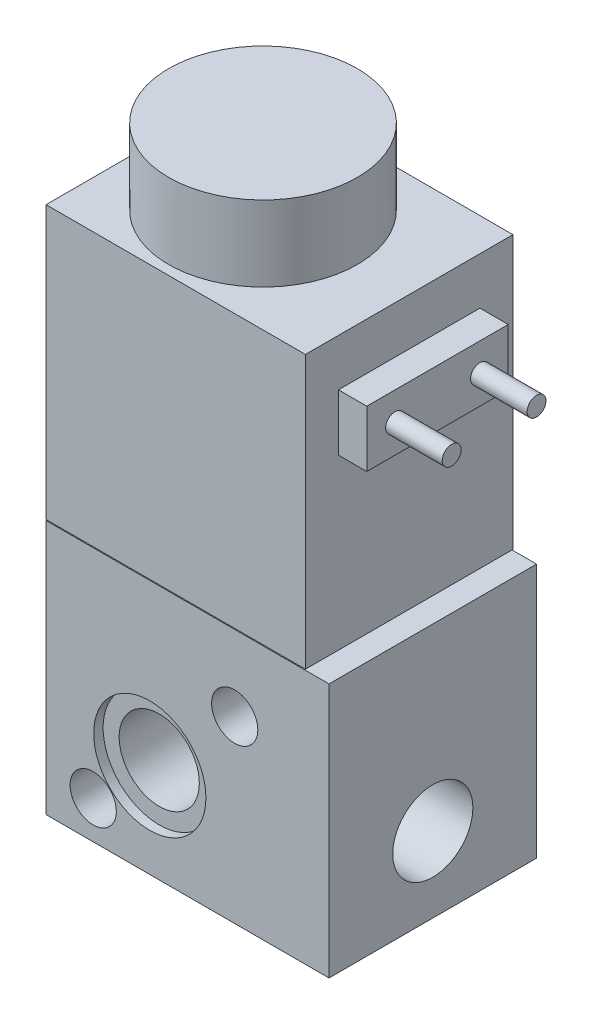
ISO-10303-21;
HEADER;
FILE_DESCRIPTION(('STEP AP214'),'2;1');
FILE_NAME('part.step','',(''),(''),'','','');
FILE_SCHEMA(('AUTOMOTIVE_DESIGN { 1 0 10303 214 1 1 1 1 }'));
ENDSEC;
DATA;
#1=APPLICATION_CONTEXT('core data for automotive mechanical design processes');
#2=APPLICATION_PROTOCOL_DEFINITION('international standard','automotive_design',2000,#1);
#3=PRODUCT_CONTEXT('',#1,'mechanical');
#4=PRODUCT('Part','Part','',(#3));
#5=PRODUCT_RELATED_PRODUCT_CATEGORY('part','',(#4));
#6=PRODUCT_DEFINITION_FORMATION('','',#4);
#7=PRODUCT_DEFINITION_CONTEXT('part definition',#1,'design');
#8=PRODUCT_DEFINITION('design','',#6,#7);
#9=PRODUCT_DEFINITION_SHAPE('','',#8);
#10=(LENGTH_UNIT() NAMED_UNIT(*) SI_UNIT(.MILLI.,.METRE.));
#11=(NAMED_UNIT(*) PLANE_ANGLE_UNIT() SI_UNIT($,.RADIAN.));
#12=(NAMED_UNIT(*) SI_UNIT($,.STERADIAN.) SOLID_ANGLE_UNIT());
#13=UNCERTAINTY_MEASURE_WITH_UNIT(LENGTH_MEASURE(1.E-05),#10,'distance_accuracy_value','');
#14=(GEOMETRIC_REPRESENTATION_CONTEXT(3) GLOBAL_UNCERTAINTY_ASSIGNED_CONTEXT((#13)) GLOBAL_UNIT_ASSIGNED_CONTEXT((#10,
#11,#12)) REPRESENTATION_CONTEXT('',''));
#15=CARTESIAN_POINT('',(0.,0.,0.));
#16=DIRECTION('',(0.,0.,1.));
#17=DIRECTION('',(1.,0.,0.));
#18=AXIS2_PLACEMENT_3D('',#15,#16,#17);
#19=CARTESIAN_POINT('',(36.5,48.,-4.5));
#20=DIRECTION('',(-1.,0.,0.));
#21=DIRECTION('',(0.,0.,-1.));
#22=AXIS2_PLACEMENT_3D('',#19,#20,#21);
#23=CYLINDRICAL_SURFACE('',#22,1.);
#24=CARTESIAN_POINT('',(36.5,48.,-4.5));
#25=DIRECTION('',(-1.,0.,0.));
#26=DIRECTION('',(0.,0.,1.));
#27=AXIS2_PLACEMENT_3D('',#24,#25,#26);
#28=CIRCLE('',#27,1.);
#29=CARTESIAN_POINT('',(36.5,48.,-3.5));
#30=VERTEX_POINT('',#29);
#31=EDGE_CURVE('E11',#30,#30,#28,.T.);
#32=ORIENTED_EDGE('',*,*,#31,.T.);
#33=EDGE_LOOP('',(#32));
#34=FACE_BOUND('',#33,.T.);
#35=CARTESIAN_POINT('',(30.5,48.,-4.5));
#36=DIRECTION('',(-1.,0.,0.));
#37=DIRECTION('',(0.,0.,1.));
#38=AXIS2_PLACEMENT_3D('',#35,#36,#37);
#39=CIRCLE('',#38,1.);
#40=CARTESIAN_POINT('',(30.5,48.,-3.5));
#41=VERTEX_POINT('',#40);
#42=EDGE_CURVE('E51',#41,#41,#39,.T.);
#43=ORIENTED_EDGE('',*,*,#42,.F.);
#44=EDGE_LOOP('',(#43));
#45=FACE_BOUND('',#44,.T.);
#46=ADVANCED_FACE('F48',(#34,#45),#23,.T.);
#47=CARTESIAN_POINT('',(36.5,48.,-4.5));
#48=DIRECTION('',(1.,0.,0.));
#49=DIRECTION('',(0.,0.,1.));
#50=AXIS2_PLACEMENT_3D('',#47,#48,#49);
#51=PLANE('',#50);
#52=ORIENTED_EDGE('',*,*,#31,.F.);
#53=EDGE_LOOP('',(#52));
#54=FACE_BOUND('',#53,.T.);
#55=ADVANCED_FACE('F63',(#54),#51,.T.);
#56=CARTESIAN_POINT('',(30.5,48.,-4.5));
#57=DIRECTION('',(1.,0.,0.));
#58=DIRECTION('',(0.,0.,1.));
#59=AXIS2_PLACEMENT_3D('',#56,#57,#58);
#60=PLANE('',#59);
#61=ORIENTED_EDGE('',*,*,#42,.T.);
#62=EDGE_LOOP('',(#61));
#63=FACE_BOUND('',#62,.T.);
#64=ADVANCED_FACE('F60',(#63),#60,.F.);
#65=CLOSED_SHELL('',(#46,#55,#64));
#66=MANIFOLD_SOLID_BREP('B2',#65);
#67=CARTESIAN_POINT('',(11.,10.,11.));
#68=DIRECTION('',(0.,0.,-1.));
#69=DIRECTION('',(-1.,0.,0.));
#70=AXIS2_PLACEMENT_3D('',#67,#68,#69);
#71=CYLINDRICAL_SURFACE('',#70,4.25);
#72=CARTESIAN_POINT('',(11.,10.,10.));
#73=DIRECTION('',(0.,0.,1.));
#74=DIRECTION('',(1.,0.,0.));
#75=AXIS2_PLACEMENT_3D('',#72,#73,#74);
#76=CIRCLE('',#75,4.25);
#77=CARTESIAN_POINT('',(15.25,10.,10.));
#78=VERTEX_POINT('',#77);
#79=EDGE_CURVE('E103',#78,#78,#76,.T.);
#80=ORIENTED_EDGE('',*,*,#79,.T.);
#81=EDGE_LOOP('',(#80));
#82=FACE_BOUND('',#81,.T.);
#83=CARTESIAN_POINT('',(11.,10.,-10.));
#84=DIRECTION('',(0.,0.,1.));
#85=DIRECTION('',(1.,0.,0.));
#86=AXIS2_PLACEMENT_3D('',#83,#84,#85);
#87=CIRCLE('',#86,4.25);
#88=CARTESIAN_POINT('',(15.25,10.,-10.));
#89=VERTEX_POINT('',#88);
#90=EDGE_CURVE('E165',#89,#89,#87,.T.);
#91=ORIENTED_EDGE('',*,*,#90,.F.);
#92=EDGE_LOOP('',(#91));
#93=FACE_BOUND('',#92,.T.);
#94=ADVANCED_FACE('F99',(#82,#93),#71,.F.);
#95=CARTESIAN_POINT('',(5.,4.,11.));
#96=DIRECTION('',(0.,0.,-1.));
#97=DIRECTION('',(-1.,0.,0.));
#98=AXIS2_PLACEMENT_3D('',#95,#96,#97);
#99=CYLINDRICAL_SURFACE('',#98,1.5);
#100=CARTESIAN_POINT('',(5.,4.,3.));
#101=DIRECTION('',(0.,0.,1.));
#102=DIRECTION('',(1.,0.,0.));
#103=AXIS2_PLACEMENT_3D('',#100,#101,#102);
#104=CIRCLE('',#103,1.5);
#105=CARTESIAN_POINT('',(6.5,4.,3.));
#106=VERTEX_POINT('',#105);
#107=EDGE_CURVE('E220',#106,#106,#104,.T.);
#108=ORIENTED_EDGE('',*,*,#107,.T.);
#109=EDGE_LOOP('',(#108));
#110=FACE_BOUND('',#109,.T.);
#111=CARTESIAN_POINT('',(5.,4.,-3.));
#112=DIRECTION('',(0.,0.,1.));
#113=DIRECTION('',(1.,0.,0.));
#114=AXIS2_PLACEMENT_3D('',#111,#112,#113);
#115=CIRCLE('',#114,1.5);
#116=CARTESIAN_POINT('',(6.5,4.,-3.));
#117=VERTEX_POINT('',#116);
#118=EDGE_CURVE('E170',#117,#117,#115,.T.);
#119=ORIENTED_EDGE('',*,*,#118,.F.);
#120=EDGE_LOOP('',(#119));
#121=FACE_BOUND('',#120,.T.);
#122=ADVANCED_FACE('F246',(#110,#121),#99,.F.);
#123=CARTESIAN_POINT('',(20.,19.,11.));
#124=DIRECTION('',(0.,0.,-1.));
#125=DIRECTION('',(-1.,0.,0.));
#126=AXIS2_PLACEMENT_3D('',#123,#124,#125);
#127=CYLINDRICAL_SURFACE('',#126,1.5);
#128=CARTESIAN_POINT('',(20.,19.,3.));
#129=DIRECTION('',(0.,0.,1.));
#130=DIRECTION('',(1.,0.,0.));
#131=AXIS2_PLACEMENT_3D('',#128,#129,#130);
#132=CIRCLE('',#131,1.5);
#133=CARTESIAN_POINT('',(21.5,19.,3.));
#134=VERTEX_POINT('',#133);
#135=EDGE_CURVE('E227',#134,#134,#132,.T.);
#136=ORIENTED_EDGE('',*,*,#135,.T.);
#137=EDGE_LOOP('',(#136));
#138=FACE_BOUND('',#137,.T.);
#139=CARTESIAN_POINT('',(20.,19.,-3.));
#140=DIRECTION('',(0.,0.,1.));
#141=DIRECTION('',(1.,0.,0.));
#142=AXIS2_PLACEMENT_3D('',#139,#140,#141);
#143=CIRCLE('',#142,1.5);
#144=CARTESIAN_POINT('',(21.5,19.,-3.));
#145=VERTEX_POINT('',#144);
#146=EDGE_CURVE('E177',#145,#145,#143,.T.);
#147=ORIENTED_EDGE('',*,*,#146,.F.);
#148=EDGE_LOOP('',(#147));
#149=FACE_BOUND('',#148,.T.);
#150=ADVANCED_FACE('F266',(#138,#149),#127,.F.);
#151=CARTESIAN_POINT('',(0.,0.,11.));
#152=DIRECTION('',(0.,0.,-1.));
#153=DIRECTION('',(-1.,0.,0.));
#154=AXIS2_PLACEMENT_3D('',#151,#152,#153);
#155=PLANE('',#154);
#156=CARTESIAN_POINT('',(11.,10.,11.));
#157=DIRECTION('',(0.,0.,1.));
#158=DIRECTION('',(1.,0.,0.));
#159=AXIS2_PLACEMENT_3D('',#156,#157,#158);
#160=CIRCLE('',#159,5.95);
#161=CARTESIAN_POINT('',(16.95,10.,11.));
#162=VERTEX_POINT('',#161);
#163=EDGE_CURVE('E209',#162,#162,#160,.T.);
#164=ORIENTED_EDGE('',*,*,#163,.F.);
#165=EDGE_LOOP('',(#164));
#166=FACE_BOUND('',#165,.T.);
#167=CARTESIAN_POINT('',(5.,4.,11.));
#168=DIRECTION('',(0.,0.,1.));
#169=DIRECTION('',(1.,0.,0.));
#170=AXIS2_PLACEMENT_3D('',#167,#168,#169);
#171=CIRCLE('',#170,2.45);
#172=CARTESIAN_POINT('',(7.45,4.,11.));
#173=VERTEX_POINT('',#172);
#174=EDGE_CURVE('E221',#173,#173,#171,.T.);
#175=ORIENTED_EDGE('',*,*,#174,.F.);
#176=EDGE_LOOP('',(#175));
#177=FACE_BOUND('',#176,.T.);
#178=CARTESIAN_POINT('',(20.,19.,11.));
#179=DIRECTION('',(0.,0.,1.));
#180=DIRECTION('',(1.,0.,0.));
#181=AXIS2_PLACEMENT_3D('',#178,#179,#180);
#182=CIRCLE('',#181,2.45);
#183=CARTESIAN_POINT('',(22.45,19.,11.));
#184=VERTEX_POINT('',#183);
#185=EDGE_CURVE('E228',#184,#184,#182,.T.);
#186=ORIENTED_EDGE('',*,*,#185,.F.);
#187=EDGE_LOOP('',(#186));
#188=FACE_BOUND('',#187,.T.);
#189=DIRECTION('',(0.,-1.,0.));
#190=VECTOR('',#189,1.);
#191=CARTESIAN_POINT('',(0.,0.,11.));
#192=LINE('',#191,#190);
#193=CARTESIAN_POINT('',(0.,27.,11.));
#194=VERTEX_POINT('',#193);
#195=CARTESIAN_POINT('',(0.,0.,11.));
#196=VERTEX_POINT('',#195);
#197=EDGE_CURVE('E231',#194,#196,#192,.T.);
#198=ORIENTED_EDGE('',*,*,#197,.T.);
#199=DIRECTION('',(1.,0.,0.));
#200=VECTOR('',#199,1.);
#201=CARTESIAN_POINT('',(0.,0.,11.));
#202=LINE('',#201,#200);
#203=CARTESIAN_POINT('',(30.,0.,11.));
#204=VERTEX_POINT('',#203);
#205=EDGE_CURVE('E233',#196,#204,#202,.T.);
#206=ORIENTED_EDGE('',*,*,#205,.T.);
#207=DIRECTION('',(0.,1.,0.));
#208=VECTOR('',#207,1.);
#209=CARTESIAN_POINT('',(30.,0.,11.));
#210=LINE('',#209,#208);
#211=CARTESIAN_POINT('',(30.,27.,11.));
#212=VERTEX_POINT('',#211);
#213=EDGE_CURVE('E121',#204,#212,#210,.T.);
#214=ORIENTED_EDGE('',*,*,#213,.T.);
#215=DIRECTION('',(-1.,0.,0.));
#216=VECTOR('',#215,1.);
#217=CARTESIAN_POINT('',(0.,27.,11.));
#218=LINE('',#217,#216);
#219=EDGE_CURVE('E116',#212,#194,#218,.T.);
#220=ORIENTED_EDGE('',*,*,#219,.T.);
#221=EDGE_LOOP('',(#198,#206,#214,#220));
#222=FACE_BOUND('',#221,.T.);
#223=ADVANCED_FACE('F263',(#166,#177,#188,#222),#155,.F.);
#224=CARTESIAN_POINT('',(0.,0.,11.));
#225=DIRECTION('',(1.,0.,0.));
#226=DIRECTION('',(0.,0.,-1.));
#227=AXIS2_PLACEMENT_3D('',#224,#225,#226);
#228=PLANE('',#227);
#229=DIRECTION('',(0.,0.,-1.));
#230=VECTOR('',#229,1.);
#231=CARTESIAN_POINT('',(0.,27.,11.));
#232=LINE('',#231,#230);
#233=CARTESIAN_POINT('',(0.,27.,-11.));
#234=VERTEX_POINT('',#233);
#235=EDGE_CURVE('E237',#194,#234,#232,.T.);
#236=ORIENTED_EDGE('',*,*,#235,.T.);
#237=DIRECTION('',(0.,-1.,0.));
#238=VECTOR('',#237,1.);
#239=CARTESIAN_POINT('',(0.,0.,-11.));
#240=LINE('',#239,#238);
#241=CARTESIAN_POINT('',(0.,0.,-11.));
#242=VERTEX_POINT('',#241);
#243=EDGE_CURVE('E181',#234,#242,#240,.T.);
#244=ORIENTED_EDGE('',*,*,#243,.T.);
#245=DIRECTION('',(0.,0.,-1.));
#246=VECTOR('',#245,1.);
#247=CARTESIAN_POINT('',(0.,0.,11.));
#248=LINE('',#247,#246);
#249=EDGE_CURVE('E46',#196,#242,#248,.T.);
#250=ORIENTED_EDGE('',*,*,#249,.F.);
#251=ORIENTED_EDGE('',*,*,#197,.F.);
#252=EDGE_LOOP('',(#236,#244,#250,#251));
#253=FACE_BOUND('',#252,.T.);
#254=ADVANCED_FACE('F101',(#253),#228,.F.);
#255=CARTESIAN_POINT('',(0.,0.,11.));
#256=DIRECTION('',(0.,1.,0.));
#257=DIRECTION('',(0.,0.,1.));
#258=AXIS2_PLACEMENT_3D('',#255,#256,#257);
#259=PLANE('',#258);
#260=CARTESIAN_POINT('',(25.,0.,7.5));
#261=DIRECTION('',(0.,-1.,0.));
#262=DIRECTION('',(0.,0.,-1.));
#263=AXIS2_PLACEMENT_3D('',#260,#261,#262);
#264=CIRCLE('',#263,1.64999999999999);
#265=CARTESIAN_POINT('',(25.,0.,5.85000000000001));
#266=VERTEX_POINT('',#265);
#267=EDGE_CURVE('E193',#266,#266,#264,.T.);
#268=ORIENTED_EDGE('',*,*,#267,.F.);
#269=EDGE_LOOP('',(#268));
#270=FACE_BOUND('',#269,.T.);
#271=ORIENTED_EDGE('',*,*,#249,.T.);
#272=DIRECTION('',(1.,0.,0.));
#273=VECTOR('',#272,1.);
#274=CARTESIAN_POINT('',(0.,0.,-11.));
#275=LINE('',#274,#273);
#276=CARTESIAN_POINT('',(30.,0.,-11.));
#277=VERTEX_POINT('',#276);
#278=EDGE_CURVE('E184',#242,#277,#275,.T.);
#279=ORIENTED_EDGE('',*,*,#278,.T.);
#280=DIRECTION('',(0.,0.,-1.));
#281=VECTOR('',#280,1.);
#282=CARTESIAN_POINT('',(30.,0.,11.));
#283=LINE('',#282,#281);
#284=EDGE_CURVE('E108',#204,#277,#283,.T.);
#285=ORIENTED_EDGE('',*,*,#284,.F.);
#286=ORIENTED_EDGE('',*,*,#205,.F.);
#287=EDGE_LOOP('',(#271,#279,#285,#286));
#288=FACE_BOUND('',#287,.T.);
#289=CARTESIAN_POINT('',(25.,0.,-7.5));
#290=DIRECTION('',(0.,1.,0.));
#291=DIRECTION('',(0.,0.,1.));
#292=AXIS2_PLACEMENT_3D('',#289,#290,#291);
#293=CIRCLE('',#292,1.64999999999999);
#294=CARTESIAN_POINT('',(25.,0.,-5.85000000000001));
#295=VERTEX_POINT('',#294);
#296=EDGE_CURVE('E156',#295,#295,#293,.T.);
#297=ORIENTED_EDGE('',*,*,#296,.T.);
#298=EDGE_LOOP('',(#297));
#299=FACE_BOUND('',#298,.T.);
#300=ADVANCED_FACE('F277',(#270,#288,#299),#259,.F.);
#301=CARTESIAN_POINT('',(30.,0.,11.));
#302=DIRECTION('',(-1.,0.,0.));
#303=DIRECTION('',(0.,0.,1.));
#304=AXIS2_PLACEMENT_3D('',#301,#302,#303);
#305=PLANE('',#304);
#306=CARTESIAN_POINT('',(30.,8.,0.));
#307=DIRECTION('',(1.,0.,0.));
#308=DIRECTION('',(0.,0.,-1.));
#309=AXIS2_PLACEMENT_3D('',#306,#307,#308);
#310=CIRCLE('',#309,4.25);
#311=CARTESIAN_POINT('',(30.,8.,-4.25));
#312=VERTEX_POINT('',#311);
#313=EDGE_CURVE('E205',#312,#312,#310,.T.);
#314=ORIENTED_EDGE('',*,*,#313,.F.);
#315=EDGE_LOOP('',(#314));
#316=FACE_BOUND('',#315,.T.);
#317=ORIENTED_EDGE('',*,*,#284,.T.);
#318=DIRECTION('',(0.,1.,0.));
#319=VECTOR('',#318,1.);
#320=CARTESIAN_POINT('',(30.,0.,-11.));
#321=LINE('',#320,#319);
#322=CARTESIAN_POINT('',(30.,27.,-11.));
#323=VERTEX_POINT('',#322);
#324=EDGE_CURVE('E187',#277,#323,#321,.T.);
#325=ORIENTED_EDGE('',*,*,#324,.T.);
#326=DIRECTION('',(0.,0.,-1.));
#327=VECTOR('',#326,1.);
#328=CARTESIAN_POINT('',(30.,27.,11.));
#329=LINE('',#328,#327);
#330=EDGE_CURVE('E239',#212,#323,#329,.T.);
#331=ORIENTED_EDGE('',*,*,#330,.F.);
#332=ORIENTED_EDGE('',*,*,#213,.F.);
#333=EDGE_LOOP('',(#317,#325,#331,#332));
#334=FACE_BOUND('',#333,.T.);
#335=ADVANCED_FACE('F284',(#316,#334),#305,.F.);
#336=CARTESIAN_POINT('',(0.,27.,11.));
#337=DIRECTION('',(0.,-1.,0.));
#338=DIRECTION('',(0.,0.,-1.));
#339=AXIS2_PLACEMENT_3D('',#336,#337,#338);
#340=PLANE('',#339);
#341=ORIENTED_EDGE('',*,*,#330,.T.);
#342=DIRECTION('',(-1.,0.,0.));
#343=VECTOR('',#342,1.);
#344=CARTESIAN_POINT('',(0.,27.,-11.));
#345=LINE('',#344,#343);
#346=EDGE_CURVE('E190',#323,#234,#345,.T.);
#347=ORIENTED_EDGE('',*,*,#346,.T.);
#348=ORIENTED_EDGE('',*,*,#235,.F.);
#349=ORIENTED_EDGE('',*,*,#219,.F.);
#350=EDGE_LOOP('',(#341,#347,#348,#349));
#351=FACE_BOUND('',#350,.T.);
#352=ADVANCED_FACE('F286',(#351),#340,.F.);
#353=CARTESIAN_POINT('',(20.,19.,3.));
#354=DIRECTION('',(0.,0.,1.));
#355=DIRECTION('',(1.,0.,0.));
#356=AXIS2_PLACEMENT_3D('',#353,#354,#355);
#357=CYLINDRICAL_SURFACE('',#356,2.45);
#358=CARTESIAN_POINT('',(20.,19.,3.));
#359=DIRECTION('',(0.,0.,1.));
#360=DIRECTION('',(1.,0.,0.));
#361=AXIS2_PLACEMENT_3D('',#358,#359,#360);
#362=CIRCLE('',#361,2.45);
#363=CARTESIAN_POINT('',(22.45,19.,3.));
#364=VERTEX_POINT('',#363);
#365=EDGE_CURVE('E224',#364,#364,#362,.T.);
#366=ORIENTED_EDGE('',*,*,#365,.F.);
#367=EDGE_LOOP('',(#366));
#368=FACE_BOUND('',#367,.T.);
#369=ORIENTED_EDGE('',*,*,#185,.T.);
#370=EDGE_LOOP('',(#369));
#371=FACE_BOUND('',#370,.T.);
#372=ADVANCED_FACE('F288',(#368,#371),#357,.F.);
#373=CARTESIAN_POINT('',(20.,19.,3.));
#374=DIRECTION('',(0.,0.,1.));
#375=DIRECTION('',(1.,0.,0.));
#376=AXIS2_PLACEMENT_3D('',#373,#374,#375);
#377=PLANE('',#376);
#378=ORIENTED_EDGE('',*,*,#135,.F.);
#379=EDGE_LOOP('',(#378));
#380=FACE_BOUND('',#379,.T.);
#381=ORIENTED_EDGE('',*,*,#365,.T.);
#382=EDGE_LOOP('',(#381));
#383=FACE_BOUND('',#382,.T.);
#384=ADVANCED_FACE('F259',(#380,#383),#377,.T.);
#385=CARTESIAN_POINT('',(5.,4.,3.));
#386=DIRECTION('',(0.,0.,1.));
#387=DIRECTION('',(1.,0.,0.));
#388=AXIS2_PLACEMENT_3D('',#385,#386,#387);
#389=CYLINDRICAL_SURFACE('',#388,2.45);
#390=CARTESIAN_POINT('',(5.,4.,3.));
#391=DIRECTION('',(0.,0.,1.));
#392=DIRECTION('',(1.,0.,0.));
#393=AXIS2_PLACEMENT_3D('',#390,#391,#392);
#394=CIRCLE('',#393,2.45);
#395=CARTESIAN_POINT('',(7.45,4.,3.));
#396=VERTEX_POINT('',#395);
#397=EDGE_CURVE('E217',#396,#396,#394,.T.);
#398=ORIENTED_EDGE('',*,*,#397,.F.);
#399=EDGE_LOOP('',(#398));
#400=FACE_BOUND('',#399,.T.);
#401=ORIENTED_EDGE('',*,*,#174,.T.);
#402=EDGE_LOOP('',(#401));
#403=FACE_BOUND('',#402,.T.);
#404=ADVANCED_FACE('F253',(#400,#403),#389,.F.);
#405=CARTESIAN_POINT('',(5.,4.,3.));
#406=DIRECTION('',(0.,0.,1.));
#407=DIRECTION('',(1.,0.,0.));
#408=AXIS2_PLACEMENT_3D('',#405,#406,#407);
#409=PLANE('',#408);
#410=ORIENTED_EDGE('',*,*,#107,.F.);
#411=EDGE_LOOP('',(#410));
#412=FACE_BOUND('',#411,.T.);
#413=ORIENTED_EDGE('',*,*,#397,.T.);
#414=EDGE_LOOP('',(#413));
#415=FACE_BOUND('',#414,.T.);
#416=ADVANCED_FACE('F249',(#412,#415),#409,.T.);
#417=CARTESIAN_POINT('',(11.,10.,10.));
#418=DIRECTION('',(0.,0.,1.));
#419=DIRECTION('',(1.,0.,0.));
#420=AXIS2_PLACEMENT_3D('',#417,#418,#419);
#421=CYLINDRICAL_SURFACE('',#420,5.95);
#422=CARTESIAN_POINT('',(11.,10.,10.));
#423=DIRECTION('',(0.,0.,1.));
#424=DIRECTION('',(1.,0.,0.));
#425=AXIS2_PLACEMENT_3D('',#422,#423,#424);
#426=CIRCLE('',#425,5.95);
#427=CARTESIAN_POINT('',(16.95,10.,10.));
#428=VERTEX_POINT('',#427);
#429=EDGE_CURVE('E212',#428,#428,#426,.T.);
#430=ORIENTED_EDGE('',*,*,#429,.F.);
#431=EDGE_LOOP('',(#430));
#432=FACE_BOUND('',#431,.T.);
#433=ORIENTED_EDGE('',*,*,#163,.T.);
#434=EDGE_LOOP('',(#433));
#435=FACE_BOUND('',#434,.T.);
#436=ADVANCED_FACE('F252',(#432,#435),#421,.F.);
#437=CARTESIAN_POINT('',(11.,10.,10.));
#438=DIRECTION('',(0.,0.,1.));
#439=DIRECTION('',(1.,0.,0.));
#440=AXIS2_PLACEMENT_3D('',#437,#438,#439);
#441=PLANE('',#440);
#442=ORIENTED_EDGE('',*,*,#79,.F.);
#443=EDGE_LOOP('',(#442));
#444=FACE_BOUND('',#443,.T.);
#445=ORIENTED_EDGE('',*,*,#429,.T.);
#446=EDGE_LOOP('',(#445));
#447=FACE_BOUND('',#446,.T.);
#448=ADVANCED_FACE('F316',(#444,#447),#441,.T.);
#449=CARTESIAN_POINT('',(22.,8.,0.));
#450=DIRECTION('',(1.,0.,0.));
#451=DIRECTION('',(0.,0.,-1.));
#452=AXIS2_PLACEMENT_3D('',#449,#450,#451);
#453=CYLINDRICAL_SURFACE('',#452,4.25);
#454=ORIENTED_EDGE('',*,*,#313,.T.);
#455=EDGE_LOOP('',(#454));
#456=FACE_BOUND('',#455,.T.);
#457=CARTESIAN_POINT('',(22.,8.,0.));
#458=DIRECTION('',(1.,0.,0.));
#459=DIRECTION('',(0.,0.,-1.));
#460=AXIS2_PLACEMENT_3D('',#457,#458,#459);
#461=CIRCLE('',#460,4.25);
#462=CARTESIAN_POINT('',(22.,8.,-4.25));
#463=VERTEX_POINT('',#462);
#464=EDGE_CURVE('E206',#463,#463,#461,.T.);
#465=ORIENTED_EDGE('',*,*,#464,.F.);
#466=EDGE_LOOP('',(#465));
#467=FACE_BOUND('',#466,.T.);
#468=ADVANCED_FACE('F320',(#456,#467),#453,.F.);
#469=CARTESIAN_POINT('',(22.,8.,0.));
#470=DIRECTION('',(1.,0.,0.));
#471=DIRECTION('',(0.,0.,-1.));
#472=AXIS2_PLACEMENT_3D('',#469,#470,#471);
#473=PLANE('',#472);
#474=ORIENTED_EDGE('',*,*,#464,.T.);
#475=EDGE_LOOP('',(#474));
#476=FACE_BOUND('',#475,.T.);
#477=ADVANCED_FACE('F324',(#476),#473,.T.);
#478=CARTESIAN_POINT('',(25.,12.5,7.5));
#479=DIRECTION('',(0.,-1.,0.));
#480=DIRECTION('',(0.,0.,-1.));
#481=AXIS2_PLACEMENT_3D('',#478,#479,#480);
#482=CONICAL_SURFACE('',#481,1.65,1.02974425867665);
#483=CARTESIAN_POINT('',(25.,13.4914200213955,7.5));
#484=VERTEX_POINT('',#483);
#485=VERTEX_LOOP('',#484);
#486=FACE_BOUND('',#485,.T.);
#487=CARTESIAN_POINT('',(25.,12.5,7.5));
#488=DIRECTION('',(0.,-1.,0.));
#489=DIRECTION('',(0.,0.,-1.));
#490=AXIS2_PLACEMENT_3D('',#487,#488,#489);
#491=CIRCLE('',#490,1.65);
#492=CARTESIAN_POINT('',(25.,12.5,5.85));
#493=VERTEX_POINT('',#492);
#494=EDGE_CURVE('E202',#493,#493,#491,.T.);
#495=ORIENTED_EDGE('',*,*,#494,.T.);
#496=EDGE_LOOP('',(#495));
#497=FACE_BOUND('',#496,.T.);
#498=ADVANCED_FACE('F328',(#486,#497),#482,.F.);
#499=CARTESIAN_POINT('',(25.,0.,7.5));
#500=DIRECTION('',(0.,-1.,0.));
#501=DIRECTION('',(0.,0.,-1.));
#502=AXIS2_PLACEMENT_3D('',#499,#500,#501);
#503=CYLINDRICAL_SURFACE('',#502,1.64999999999999);
#504=ORIENTED_EDGE('',*,*,#494,.F.);
#505=EDGE_LOOP('',(#504));
#506=FACE_BOUND('',#505,.T.);
#507=ORIENTED_EDGE('',*,*,#267,.T.);
#508=EDGE_LOOP('',(#507));
#509=FACE_BOUND('',#508,.T.);
#510=ADVANCED_FACE('F332',(#506,#509),#503,.F.);
#511=CARTESIAN_POINT('',(0.,0.,-11.));
#512=DIRECTION('',(0.,0.,1.));
#513=DIRECTION('',(-1.,0.,0.));
#514=AXIS2_PLACEMENT_3D('',#511,#512,#513);
#515=PLANE('',#514);
#516=CARTESIAN_POINT('',(11.,10.,-11.));
#517=DIRECTION('',(0.,0.,1.));
#518=DIRECTION('',(1.,0.,0.));
#519=AXIS2_PLACEMENT_3D('',#516,#517,#518);
#520=CIRCLE('',#519,5.95);
#521=CARTESIAN_POINT('',(16.95,10.,-11.));
#522=VERTEX_POINT('',#521);
#523=EDGE_CURVE('E155',#522,#522,#520,.T.);
#524=ORIENTED_EDGE('',*,*,#523,.T.);
#525=EDGE_LOOP('',(#524));
#526=FACE_BOUND('',#525,.T.);
#527=CARTESIAN_POINT('',(5.,4.,-11.));
#528=DIRECTION('',(0.,0.,1.));
#529=DIRECTION('',(1.,0.,0.));
#530=AXIS2_PLACEMENT_3D('',#527,#528,#529);
#531=CIRCLE('',#530,2.45);
#532=CARTESIAN_POINT('',(7.45,4.,-11.));
#533=VERTEX_POINT('',#532);
#534=EDGE_CURVE('E171',#533,#533,#531,.T.);
#535=ORIENTED_EDGE('',*,*,#534,.T.);
#536=EDGE_LOOP('',(#535));
#537=FACE_BOUND('',#536,.T.);
#538=CARTESIAN_POINT('',(20.,19.,-11.));
#539=DIRECTION('',(0.,0.,1.));
#540=DIRECTION('',(1.,0.,0.));
#541=AXIS2_PLACEMENT_3D('',#538,#539,#540);
#542=CIRCLE('',#541,2.45);
#543=CARTESIAN_POINT('',(22.45,19.,-11.));
#544=VERTEX_POINT('',#543);
#545=EDGE_CURVE('E178',#544,#544,#542,.T.);
#546=ORIENTED_EDGE('',*,*,#545,.T.);
#547=EDGE_LOOP('',(#546));
#548=FACE_BOUND('',#547,.T.);
#549=ORIENTED_EDGE('',*,*,#243,.F.);
#550=ORIENTED_EDGE('',*,*,#346,.F.);
#551=ORIENTED_EDGE('',*,*,#324,.F.);
#552=ORIENTED_EDGE('',*,*,#278,.F.);
#553=EDGE_LOOP('',(#549,#550,#551,#552));
#554=FACE_BOUND('',#553,.T.);
#555=ADVANCED_FACE('F281',(#526,#537,#548,#554),#515,.F.);
#556=CARTESIAN_POINT('',(20.,19.,-3.));
#557=DIRECTION('',(0.,0.,-1.));
#558=DIRECTION('',(1.,0.,0.));
#559=AXIS2_PLACEMENT_3D('',#556,#557,#558);
#560=CYLINDRICAL_SURFACE('',#559,2.45);
#561=CARTESIAN_POINT('',(20.,19.,-3.));
#562=DIRECTION('',(0.,0.,1.));
#563=DIRECTION('',(1.,0.,0.));
#564=AXIS2_PLACEMENT_3D('',#561,#562,#563);
#565=CIRCLE('',#564,2.45);
#566=CARTESIAN_POINT('',(22.45,19.,-3.));
#567=VERTEX_POINT('',#566);
#568=EDGE_CURVE('E174',#567,#567,#565,.T.);
#569=ORIENTED_EDGE('',*,*,#568,.T.);
#570=EDGE_LOOP('',(#569));
#571=FACE_BOUND('',#570,.T.);
#572=ORIENTED_EDGE('',*,*,#545,.F.);
#573=EDGE_LOOP('',(#572));
#574=FACE_BOUND('',#573,.T.);
#575=ADVANCED_FACE('F339',(#571,#574),#560,.F.);
#576=CARTESIAN_POINT('',(20.,19.,-3.));
#577=DIRECTION('',(0.,0.,-1.));
#578=DIRECTION('',(1.,0.,0.));
#579=AXIS2_PLACEMENT_3D('',#576,#577,#578);
#580=PLANE('',#579);
#581=ORIENTED_EDGE('',*,*,#146,.T.);
#582=EDGE_LOOP('',(#581));
#583=FACE_BOUND('',#582,.T.);
#584=ORIENTED_EDGE('',*,*,#568,.F.);
#585=EDGE_LOOP('',(#584));
#586=FACE_BOUND('',#585,.T.);
#587=ADVANCED_FACE('F343',(#583,#586),#580,.T.);
#588=CARTESIAN_POINT('',(5.,4.,-3.));
#589=DIRECTION('',(0.,0.,-1.));
#590=DIRECTION('',(1.,0.,0.));
#591=AXIS2_PLACEMENT_3D('',#588,#589,#590);
#592=CYLINDRICAL_SURFACE('',#591,2.45);
#593=CARTESIAN_POINT('',(5.,4.,-3.));
#594=DIRECTION('',(0.,0.,1.));
#595=DIRECTION('',(1.,0.,0.));
#596=AXIS2_PLACEMENT_3D('',#593,#594,#595);
#597=CIRCLE('',#596,2.45);
#598=CARTESIAN_POINT('',(7.45,4.,-3.));
#599=VERTEX_POINT('',#598);
#600=EDGE_CURVE('E167',#599,#599,#597,.T.);
#601=ORIENTED_EDGE('',*,*,#600,.T.);
#602=EDGE_LOOP('',(#601));
#603=FACE_BOUND('',#602,.T.);
#604=ORIENTED_EDGE('',*,*,#534,.F.);
#605=EDGE_LOOP('',(#604));
#606=FACE_BOUND('',#605,.T.);
#607=ADVANCED_FACE('F347',(#603,#606),#592,.F.);
#608=CARTESIAN_POINT('',(5.,4.,-3.));
#609=DIRECTION('',(0.,0.,-1.));
#610=DIRECTION('',(1.,0.,0.));
#611=AXIS2_PLACEMENT_3D('',#608,#609,#610);
#612=PLANE('',#611);
#613=ORIENTED_EDGE('',*,*,#118,.T.);
#614=EDGE_LOOP('',(#613));
#615=FACE_BOUND('',#614,.T.);
#616=ORIENTED_EDGE('',*,*,#600,.F.);
#617=EDGE_LOOP('',(#616));
#618=FACE_BOUND('',#617,.T.);
#619=ADVANCED_FACE('F351',(#615,#618),#612,.T.);
#620=CARTESIAN_POINT('',(11.,10.,-10.));
#621=DIRECTION('',(0.,0.,-1.));
#622=DIRECTION('',(1.,0.,0.));
#623=AXIS2_PLACEMENT_3D('',#620,#621,#622);
#624=CYLINDRICAL_SURFACE('',#623,5.95);
#625=CARTESIAN_POINT('',(11.,10.,-10.));
#626=DIRECTION('',(0.,0.,1.));
#627=DIRECTION('',(1.,0.,0.));
#628=AXIS2_PLACEMENT_3D('',#625,#626,#627);
#629=CIRCLE('',#628,5.95);
#630=CARTESIAN_POINT('',(16.95,10.,-10.));
#631=VERTEX_POINT('',#630);
#632=EDGE_CURVE('E159',#631,#631,#629,.T.);
#633=ORIENTED_EDGE('',*,*,#632,.T.);
#634=EDGE_LOOP('',(#633));
#635=FACE_BOUND('',#634,.T.);
#636=ORIENTED_EDGE('',*,*,#523,.F.);
#637=EDGE_LOOP('',(#636));
#638=FACE_BOUND('',#637,.T.);
#639=ADVANCED_FACE('F355',(#635,#638),#624,.F.);
#640=CARTESIAN_POINT('',(11.,10.,-10.));
#641=DIRECTION('',(0.,0.,-1.));
#642=DIRECTION('',(1.,0.,0.));
#643=AXIS2_PLACEMENT_3D('',#640,#641,#642);
#644=PLANE('',#643);
#645=ORIENTED_EDGE('',*,*,#90,.T.);
#646=EDGE_LOOP('',(#645));
#647=FACE_BOUND('',#646,.T.);
#648=ORIENTED_EDGE('',*,*,#632,.F.);
#649=EDGE_LOOP('',(#648));
#650=FACE_BOUND('',#649,.T.);
#651=ADVANCED_FACE('F149',(#647,#650),#644,.T.);
#652=CARTESIAN_POINT('',(25.,12.5,-7.5));
#653=DIRECTION('',(0.,-1.,0.));
#654=DIRECTION('',(0.,0.,1.));
#655=AXIS2_PLACEMENT_3D('',#652,#653,#654);
#656=CONICAL_SURFACE('',#655,1.65,1.02974425867665);
#657=CARTESIAN_POINT('',(25.,13.4914200213955,-7.5));
#658=VERTEX_POINT('',#657);
#659=VERTEX_LOOP('',#658);
#660=FACE_BOUND('',#659,.T.);
#661=CARTESIAN_POINT('',(25.,12.5,-7.5));
#662=DIRECTION('',(0.,1.,0.));
#663=DIRECTION('',(0.,0.,1.));
#664=AXIS2_PLACEMENT_3D('',#661,#662,#663);
#665=CIRCLE('',#664,1.65);
#666=CARTESIAN_POINT('',(25.,12.5,-5.85));
#667=VERTEX_POINT('',#666);
#668=EDGE_CURVE('E153',#667,#667,#665,.T.);
#669=ORIENTED_EDGE('',*,*,#668,.F.);
#670=EDGE_LOOP('',(#669));
#671=FACE_BOUND('',#670,.T.);
#672=ADVANCED_FACE('F145',(#660,#671),#656,.F.);
#673=CARTESIAN_POINT('',(25.,0.,-7.5));
#674=DIRECTION('',(0.,-1.,0.));
#675=DIRECTION('',(0.,0.,1.));
#676=AXIS2_PLACEMENT_3D('',#673,#674,#675);
#677=CYLINDRICAL_SURFACE('',#676,1.64999999999999);
#678=ORIENTED_EDGE('',*,*,#668,.T.);
#679=EDGE_LOOP('',(#678));
#680=FACE_BOUND('',#679,.T.);
#681=ORIENTED_EDGE('',*,*,#296,.F.);
#682=EDGE_LOOP('',(#681));
#683=FACE_BOUND('',#682,.T.);
#684=ADVANCED_FACE('F148',(#680,#683),#677,.F.);
#685=CLOSED_SHELL('',(#94,#122,#150,#223,#254,#300,#335,#352,#372,#384,#404,#416,#436,#448,#468,
#477,#498,#510,#555,#575,#587,#607,#619,#639,#651,#672,#684));
#686=MANIFOLD_SOLID_BREP('B6',#685);
#687=CARTESIAN_POINT('',(0.,56.,11.));
#688=DIRECTION('',(0.,-1.,0.));
#689=DIRECTION('',(0.,0.,-1.));
#690=AXIS2_PLACEMENT_3D('',#687,#688,#689);
#691=PLANE('',#690);
#692=DIRECTION('',(0.,0.,-1.));
#693=VECTOR('',#692,1.);
#694=CARTESIAN_POINT('',(27.5,56.,11.));
#695=LINE('',#694,#693);
#696=CARTESIAN_POINT('',(27.5,56.,11.));
#697=VERTEX_POINT('',#696);
#698=CARTESIAN_POINT('',(27.5,56.,-11.));
#699=VERTEX_POINT('',#698);
#700=EDGE_CURVE('E742',#697,#699,#695,.T.);
#701=ORIENTED_EDGE('',*,*,#700,.T.);
#702=DIRECTION('',(-1.,0.,0.));
#703=VECTOR('',#702,1.);
#704=CARTESIAN_POINT('',(0.,56.,-11.));
#705=LINE('',#704,#703);
#706=CARTESIAN_POINT('',(0.,56.,-11.));
#707=VERTEX_POINT('',#706);
#708=EDGE_CURVE('E707',#699,#707,#705,.T.);
#709=ORIENTED_EDGE('',*,*,#708,.T.);
#710=DIRECTION('',(0.,0.,-1.));
#711=VECTOR('',#710,1.);
#712=CARTESIAN_POINT('',(0.,56.,11.));
#713=LINE('',#712,#711);
#714=CARTESIAN_POINT('',(0.,56.,11.));
#715=VERTEX_POINT('',#714);
#716=EDGE_CURVE('E740',#715,#707,#713,.T.);
#717=ORIENTED_EDGE('',*,*,#716,.F.);
#718=DIRECTION('',(-1.,0.,0.));
#719=VECTOR('',#718,1.);
#720=CARTESIAN_POINT('',(0.,56.,11.));
#721=LINE('',#720,#719);
#722=EDGE_CURVE('E738',#697,#715,#721,.T.);
#723=ORIENTED_EDGE('',*,*,#722,.F.);
#724=EDGE_LOOP('',(#701,#709,#717,#723));
#725=FACE_BOUND('',#724,.T.);
#726=CARTESIAN_POINT('',(12.,56.,0.));
#727=DIRECTION('',(0.,-1.,0.));
#728=DIRECTION('',(0.,0.,-1.));
#729=AXIS2_PLACEMENT_3D('',#726,#727,#728);
#730=CIRCLE('',#729,10.);
#731=CARTESIAN_POINT('',(12.,56.,-10.));
#732=VERTEX_POINT('',#731);
#733=EDGE_CURVE('E97',#732,#732,#730,.F.);
#734=ORIENTED_EDGE('',*,*,#733,.F.);
#735=EDGE_LOOP('',(#734));
#736=FACE_BOUND('',#735,.T.);
#737=ADVANCED_FACE('F606',(#725,#736),#691,.F.);
#738=CARTESIAN_POINT('',(27.5,27.1,11.));
#739=DIRECTION('',(-1.,0.,0.));
#740=DIRECTION('',(0.,0.,1.));
#741=AXIS2_PLACEMENT_3D('',#738,#739,#740);
#742=PLANE('',#741);
#743=DIRECTION('',(0.,1.,0.));
#744=VECTOR('',#743,1.);
#745=CARTESIAN_POINT('',(27.5,27.1,-11.));
#746=LINE('',#745,#744);
#747=CARTESIAN_POINT('',(27.5,27.1,-11.));
#748=VERTEX_POINT('',#747);
#749=EDGE_CURVE('E704',#748,#699,#746,.T.);
#750=ORIENTED_EDGE('',*,*,#749,.T.);
#751=ORIENTED_EDGE('',*,*,#700,.F.);
#752=DIRECTION('',(0.,1.,0.));
#753=VECTOR('',#752,1.);
#754=CARTESIAN_POINT('',(27.5,27.1,11.));
#755=LINE('',#754,#753);
#756=CARTESIAN_POINT('',(27.5,27.1,11.));
#757=VERTEX_POINT('',#756);
#758=EDGE_CURVE('E736',#757,#697,#755,.T.);
#759=ORIENTED_EDGE('',*,*,#758,.F.);
#760=DIRECTION('',(0.,0.,-1.));
#761=VECTOR('',#760,1.);
#762=CARTESIAN_POINT('',(27.5,27.1,11.));
#763=LINE('',#762,#761);
#764=EDGE_CURVE('E743',#757,#748,#763,.T.);
#765=ORIENTED_EDGE('',*,*,#764,.T.);
#766=EDGE_LOOP('',(#750,#751,#759,#765));
#767=FACE_BOUND('',#766,.T.);
#768=DIRECTION('',(0.,0.,1.));
#769=VECTOR('',#768,1.);
#770=CARTESIAN_POINT('',(27.5,51.,7.5));
#771=LINE('',#770,#769);
#772=CARTESIAN_POINT('',(27.5,51.,-7.5));
#773=VERTEX_POINT('',#772);
#774=CARTESIAN_POINT('',(27.5,51.,7.5));
#775=VERTEX_POINT('',#774);
#776=EDGE_CURVE('E710',#773,#775,#771,.T.);
#777=ORIENTED_EDGE('',*,*,#776,.F.);
#778=DIRECTION('',(0.,-1.,0.));
#779=VECTOR('',#778,1.);
#780=CARTESIAN_POINT('',(27.5,51.,-7.5));
#781=LINE('',#780,#779);
#782=CARTESIAN_POINT('',(27.5,45.,-7.5));
#783=VERTEX_POINT('',#782);
#784=EDGE_CURVE('E692',#773,#783,#781,.T.);
#785=ORIENTED_EDGE('',*,*,#784,.T.);
#786=DIRECTION('',(0.,0.,-1.));
#787=VECTOR('',#786,1.);
#788=CARTESIAN_POINT('',(27.5,45.,7.5));
#789=LINE('',#788,#787);
#790=CARTESIAN_POINT('',(27.5,45.,7.5));
#791=VERTEX_POINT('',#790);
#792=EDGE_CURVE('E626',#791,#783,#789,.T.);
#793=ORIENTED_EDGE('',*,*,#792,.F.);
#794=DIRECTION('',(0.,-1.,0.));
#795=VECTOR('',#794,1.);
#796=CARTESIAN_POINT('',(27.5,51.,7.5));
#797=LINE('',#796,#795);
#798=EDGE_CURVE('E621',#775,#791,#797,.T.);
#799=ORIENTED_EDGE('',*,*,#798,.F.);
#800=EDGE_LOOP('',(#777,#785,#793,#799));
#801=FACE_BOUND('',#800,.T.);
#802=ADVANCED_FACE('F763',(#767,#801),#742,.F.);
#803=CARTESIAN_POINT('',(0.,27.1,11.));
#804=DIRECTION('',(1.,0.,0.));
#805=DIRECTION('',(0.,0.,-1.));
#806=AXIS2_PLACEMENT_3D('',#803,#804,#805);
#807=PLANE('',#806);
#808=ORIENTED_EDGE('',*,*,#716,.T.);
#809=DIRECTION('',(0.,-1.,0.));
#810=VECTOR('',#809,1.);
#811=CARTESIAN_POINT('',(0.,27.1,-11.));
#812=LINE('',#811,#810);
#813=CARTESIAN_POINT('',(0.,27.1,-11.));
#814=VERTEX_POINT('',#813);
#815=EDGE_CURVE('E687',#707,#814,#812,.T.);
#816=ORIENTED_EDGE('',*,*,#815,.T.);
#817=DIRECTION('',(0.,0.,-1.));
#818=VECTOR('',#817,1.);
#819=CARTESIAN_POINT('',(0.,27.1,11.));
#820=LINE('',#819,#818);
#821=CARTESIAN_POINT('',(0.,27.1,11.));
#822=VERTEX_POINT('',#821);
#823=EDGE_CURVE('E614',#822,#814,#820,.T.);
#824=ORIENTED_EDGE('',*,*,#823,.F.);
#825=DIRECTION('',(0.,-1.,0.));
#826=VECTOR('',#825,1.);
#827=CARTESIAN_POINT('',(0.,27.1,11.));
#828=LINE('',#827,#826);
#829=EDGE_CURVE('E730',#715,#822,#828,.T.);
#830=ORIENTED_EDGE('',*,*,#829,.F.);
#831=EDGE_LOOP('',(#808,#816,#824,#830));
#832=FACE_BOUND('',#831,.T.);
#833=ADVANCED_FACE('F608',(#832),#807,.F.);
#834=CARTESIAN_POINT('',(0.,27.1,11.));
#835=DIRECTION('',(0.,1.,0.));
#836=DIRECTION('',(0.,0.,1.));
#837=AXIS2_PLACEMENT_3D('',#834,#835,#836);
#838=PLANE('',#837);
#839=ORIENTED_EDGE('',*,*,#823,.T.);
#840=DIRECTION('',(1.,0.,0.));
#841=VECTOR('',#840,1.);
#842=CARTESIAN_POINT('',(0.,27.1,-11.));
#843=LINE('',#842,#841);
#844=EDGE_CURVE('E701',#814,#748,#843,.T.);
#845=ORIENTED_EDGE('',*,*,#844,.T.);
#846=ORIENTED_EDGE('',*,*,#764,.F.);
#847=DIRECTION('',(1.,0.,0.));
#848=VECTOR('',#847,1.);
#849=CARTESIAN_POINT('',(0.,27.1,11.));
#850=LINE('',#849,#848);
#851=EDGE_CURVE('E732',#822,#757,#850,.T.);
#852=ORIENTED_EDGE('',*,*,#851,.F.);
#853=EDGE_LOOP('',(#839,#845,#846,#852));
#854=FACE_BOUND('',#853,.T.);
#855=ADVANCED_FACE('F750',(#854),#838,.F.);
#856=CARTESIAN_POINT('',(0.,0.,11.));
#857=DIRECTION('',(0.,0.,-1.));
#858=DIRECTION('',(-1.,0.,0.));
#859=AXIS2_PLACEMENT_3D('',#856,#857,#858);
#860=PLANE('',#859);
#861=ORIENTED_EDGE('',*,*,#829,.T.);
#862=ORIENTED_EDGE('',*,*,#851,.T.);
#863=ORIENTED_EDGE('',*,*,#758,.T.);
#864=ORIENTED_EDGE('',*,*,#722,.T.);
#865=EDGE_LOOP('',(#861,#862,#863,#864));
#866=FACE_BOUND('',#865,.T.);
#867=ADVANCED_FACE('F765',(#866),#860,.F.);
#868=CARTESIAN_POINT('',(30.5,51.,7.5));
#869=DIRECTION('',(0.,0.,-1.));
#870=DIRECTION('',(0.,1.,0.));
#871=AXIS2_PLACEMENT_3D('',#868,#869,#870);
#872=PLANE('',#871);
#873=ORIENTED_EDGE('',*,*,#798,.T.);
#874=DIRECTION('',(-1.,0.,0.));
#875=VECTOR('',#874,1.);
#876=CARTESIAN_POINT('',(30.5,45.,7.5));
#877=LINE('',#876,#875);
#878=CARTESIAN_POINT('',(30.5,45.,7.5));
#879=VERTEX_POINT('',#878);
#880=EDGE_CURVE('E729',#879,#791,#877,.T.);
#881=ORIENTED_EDGE('',*,*,#880,.F.);
#882=DIRECTION('',(0.,-1.,0.));
#883=VECTOR('',#882,1.);
#884=CARTESIAN_POINT('',(30.5,51.,7.5));
#885=LINE('',#884,#883);
#886=CARTESIAN_POINT('',(30.5,51.,7.5));
#887=VERTEX_POINT('',#886);
#888=EDGE_CURVE('E677',#887,#879,#885,.T.);
#889=ORIENTED_EDGE('',*,*,#888,.F.);
#890=DIRECTION('',(-1.,0.,0.));
#891=VECTOR('',#890,1.);
#892=CARTESIAN_POINT('',(30.5,51.,7.5));
#893=LINE('',#892,#891);
#894=EDGE_CURVE('E713',#887,#775,#893,.T.);
#895=ORIENTED_EDGE('',*,*,#894,.T.);
#896=EDGE_LOOP('',(#873,#881,#889,#895));
#897=FACE_BOUND('',#896,.T.);
#898=ADVANCED_FACE('F728',(#897),#872,.F.);
#899=CARTESIAN_POINT('',(30.5,45.,7.5));
#900=DIRECTION('',(0.,1.,0.));
#901=DIRECTION('',(0.,0.,1.));
#902=AXIS2_PLACEMENT_3D('',#899,#900,#901);
#903=PLANE('',#902);
#904=ORIENTED_EDGE('',*,*,#792,.T.);
#905=DIRECTION('',(-1.,0.,0.));
#906=VECTOR('',#905,1.);
#907=CARTESIAN_POINT('',(30.5,45.,-7.5));
#908=LINE('',#907,#906);
#909=CARTESIAN_POINT('',(30.5,45.,-7.5));
#910=VERTEX_POINT('',#909);
#911=EDGE_CURVE('E683',#910,#783,#908,.T.);
#912=ORIENTED_EDGE('',*,*,#911,.F.);
#913=DIRECTION('',(0.,0.,-1.));
#914=VECTOR('',#913,1.);
#915=CARTESIAN_POINT('',(30.5,45.,7.5));
#916=LINE('',#915,#914);
#917=EDGE_CURVE('E670',#879,#910,#916,.T.);
#918=ORIENTED_EDGE('',*,*,#917,.F.);
#919=ORIENTED_EDGE('',*,*,#880,.T.);
#920=EDGE_LOOP('',(#904,#912,#918,#919));
#921=FACE_BOUND('',#920,.T.);
#922=ADVANCED_FACE('F684',(#921),#903,.F.);
#923=CARTESIAN_POINT('',(30.5,51.,7.5));
#924=DIRECTION('',(0.,-1.,0.));
#925=DIRECTION('',(0.,0.,-1.));
#926=AXIS2_PLACEMENT_3D('',#923,#924,#925);
#927=PLANE('',#926);
#928=ORIENTED_EDGE('',*,*,#776,.T.);
#929=ORIENTED_EDGE('',*,*,#894,.F.);
#930=DIRECTION('',(0.,0.,1.));
#931=VECTOR('',#930,1.);
#932=CARTESIAN_POINT('',(30.5,51.,7.5));
#933=LINE('',#932,#931);
#934=CARTESIAN_POINT('',(30.5,51.,-7.5));
#935=VERTEX_POINT('',#934);
#936=EDGE_CURVE('E680',#935,#887,#933,.T.);
#937=ORIENTED_EDGE('',*,*,#936,.F.);
#938=DIRECTION('',(-1.,0.,0.));
#939=VECTOR('',#938,1.);
#940=CARTESIAN_POINT('',(30.5,51.,-7.5));
#941=LINE('',#940,#939);
#942=EDGE_CURVE('E688',#935,#773,#941,.T.);
#943=ORIENTED_EDGE('',*,*,#942,.T.);
#944=EDGE_LOOP('',(#928,#929,#937,#943));
#945=FACE_BOUND('',#944,.T.);
#946=ADVANCED_FACE('F726',(#945),#927,.F.);
#947=CARTESIAN_POINT('',(30.5,0.,0.));
#948=DIRECTION('',(1.,0.,0.));
#949=DIRECTION('',(0.,0.,-1.));
#950=AXIS2_PLACEMENT_3D('',#947,#948,#949);
#951=PLANE('',#950);
#952=ORIENTED_EDGE('',*,*,#888,.T.);
#953=ORIENTED_EDGE('',*,*,#917,.T.);
#954=DIRECTION('',(0.,-1.,0.));
#955=VECTOR('',#954,1.);
#956=CARTESIAN_POINT('',(30.5,51.,-7.5));
#957=LINE('',#956,#955);
#958=EDGE_CURVE('E674',#935,#910,#957,.T.);
#959=ORIENTED_EDGE('',*,*,#958,.F.);
#960=ORIENTED_EDGE('',*,*,#936,.T.);
#961=EDGE_LOOP('',(#952,#953,#959,#960));
#962=FACE_BOUND('',#961,.T.);
#963=ADVANCED_FACE('F672',(#962),#951,.T.);
#964=CARTESIAN_POINT('',(0.,0.,-11.));
#965=DIRECTION('',(0.,0.,1.));
#966=DIRECTION('',(-1.,0.,0.));
#967=AXIS2_PLACEMENT_3D('',#964,#965,#966);
#968=PLANE('',#967);
#969=ORIENTED_EDGE('',*,*,#815,.F.);
#970=ORIENTED_EDGE('',*,*,#708,.F.);
#971=ORIENTED_EDGE('',*,*,#749,.F.);
#972=ORIENTED_EDGE('',*,*,#844,.F.);
#973=EDGE_LOOP('',(#969,#970,#971,#972));
#974=FACE_BOUND('',#973,.T.);
#975=ADVANCED_FACE('F756',(#974),#968,.F.);
#976=CARTESIAN_POINT('',(30.5,51.,-7.5));
#977=DIRECTION('',(0.,0.,1.));
#978=DIRECTION('',(0.,1.,0.));
#979=AXIS2_PLACEMENT_3D('',#976,#977,#978);
#980=PLANE('',#979);
#981=ORIENTED_EDGE('',*,*,#784,.F.);
#982=ORIENTED_EDGE('',*,*,#942,.F.);
#983=ORIENTED_EDGE('',*,*,#958,.T.);
#984=ORIENTED_EDGE('',*,*,#911,.T.);
#985=EDGE_LOOP('',(#981,#982,#983,#984));
#986=FACE_BOUND('',#985,.T.);
#987=ADVANCED_FACE('F690',(#986),#980,.F.);
#988=CARTESIAN_POINT('',(12.,64.,0.));
#989=DIRECTION('',(0.,-1.,0.));
#990=DIRECTION('',(0.,0.,-1.));
#991=AXIS2_PLACEMENT_3D('',#988,#989,#990);
#992=CYLINDRICAL_SURFACE('',#991,10.);
#993=CARTESIAN_POINT('',(12.,64.,0.));
#994=DIRECTION('',(0.,1.,0.));
#995=DIRECTION('',(0.,0.,1.));
#996=AXIS2_PLACEMENT_3D('',#993,#994,#995);
#997=CIRCLE('',#996,10.);
#998=CARTESIAN_POINT('',(12.,64.,10.));
#999=VERTEX_POINT('',#998);
#1000=EDGE_CURVE('E695',#999,#999,#997,.T.);
#1001=ORIENTED_EDGE('',*,*,#1000,.F.);
#1002=EDGE_LOOP('',(#1001));
#1003=FACE_BOUND('',#1002,.T.);
#1004=ORIENTED_EDGE('',*,*,#733,.T.);
#1005=EDGE_LOOP('',(#1004));
#1006=FACE_BOUND('',#1005,.T.);
#1007=ADVANCED_FACE('F832',(#1003,#1006),#992,.T.);
#1008=CARTESIAN_POINT('',(12.,64.,0.));
#1009=DIRECTION('',(0.,1.,0.));
#1010=DIRECTION('',(0.,0.,1.));
#1011=AXIS2_PLACEMENT_3D('',#1008,#1009,#1010);
#1012=PLANE('',#1011);
#1013=ORIENTED_EDGE('',*,*,#1000,.T.);
#1014=EDGE_LOOP('',(#1013));
#1015=FACE_BOUND('',#1014,.T.);
#1016=ADVANCED_FACE('F847',(#1015),#1012,.T.);
#1017=CLOSED_SHELL('',(#737,#802,#833,#855,#867,#898,#922,#946,#963,#975,#987,#1007,#1016));
#1018=MANIFOLD_SOLID_BREP('B40',#1017);
#1019=CARTESIAN_POINT('',(36.5,48.,4.5));
#1020=DIRECTION('',(-1.,0.,0.));
#1021=DIRECTION('',(0.,0.,1.));
#1022=AXIS2_PLACEMENT_3D('',#1019,#1020,#1021);
#1023=CYLINDRICAL_SURFACE('',#1022,1.);
#1024=CARTESIAN_POINT('',(36.5,48.,4.5));
#1025=DIRECTION('',(1.,0.,0.));
#1026=DIRECTION('',(0.,0.,-1.));
#1027=AXIS2_PLACEMENT_3D('',#1024,#1025,#1026);
#1028=CIRCLE('',#1027,1.);
#1029=CARTESIAN_POINT('',(36.5,48.,3.5));
#1030=VERTEX_POINT('',#1029);
#1031=EDGE_CURVE('E605',#1030,#1030,#1028,.T.);
#1032=ORIENTED_EDGE('',*,*,#1031,.F.);
#1033=EDGE_LOOP('',(#1032));
#1034=FACE_BOUND('',#1033,.T.);
#1035=CARTESIAN_POINT('',(30.5,48.,4.5));
#1036=DIRECTION('',(1.,0.,0.));
#1037=DIRECTION('',(0.,0.,-1.));
#1038=AXIS2_PLACEMENT_3D('',#1035,#1036,#1037);
#1039=CIRCLE('',#1038,1.);
#1040=CARTESIAN_POINT('',(30.5,48.,3.5));
#1041=VERTEX_POINT('',#1040);
#1042=EDGE_CURVE('E903',#1041,#1041,#1039,.T.);
#1043=ORIENTED_EDGE('',*,*,#1042,.T.);
#1044=EDGE_LOOP('',(#1043));
#1045=FACE_BOUND('',#1044,.T.);
#1046=ADVANCED_FACE('F900',(#1034,#1045),#1023,.T.);
#1047=CARTESIAN_POINT('',(36.5,48.,4.5));
#1048=DIRECTION('',(1.,0.,0.));
#1049=DIRECTION('',(0.,0.,-1.));
#1050=AXIS2_PLACEMENT_3D('',#1047,#1048,#1049);
#1051=PLANE('',#1050);
#1052=ORIENTED_EDGE('',*,*,#1031,.T.);
#1053=EDGE_LOOP('',(#1052));
#1054=FACE_BOUND('',#1053,.T.);
#1055=ADVANCED_FACE('F915',(#1054),#1051,.T.);
#1056=CARTESIAN_POINT('',(30.5,48.,4.5));
#1057=DIRECTION('',(1.,0.,0.));
#1058=DIRECTION('',(0.,0.,-1.));
#1059=AXIS2_PLACEMENT_3D('',#1056,#1057,#1058);
#1060=PLANE('',#1059);
#1061=ORIENTED_EDGE('',*,*,#1042,.F.);
#1062=EDGE_LOOP('',(#1061));
#1063=FACE_BOUND('',#1062,.T.);
#1064=ADVANCED_FACE('F913',(#1063),#1060,.F.);
#1065=CLOSED_SHELL('',(#1046,#1055,#1064));
#1066=MANIFOLD_SOLID_BREP('B91',#1065);
#1067=ADVANCED_BREP_SHAPE_REPRESENTATION('',(#18,#66,#686,#1018,#1066),#14);
#1068=SHAPE_DEFINITION_REPRESENTATION(#9,#1067);
ENDSEC;
END-ISO-10303-21;
